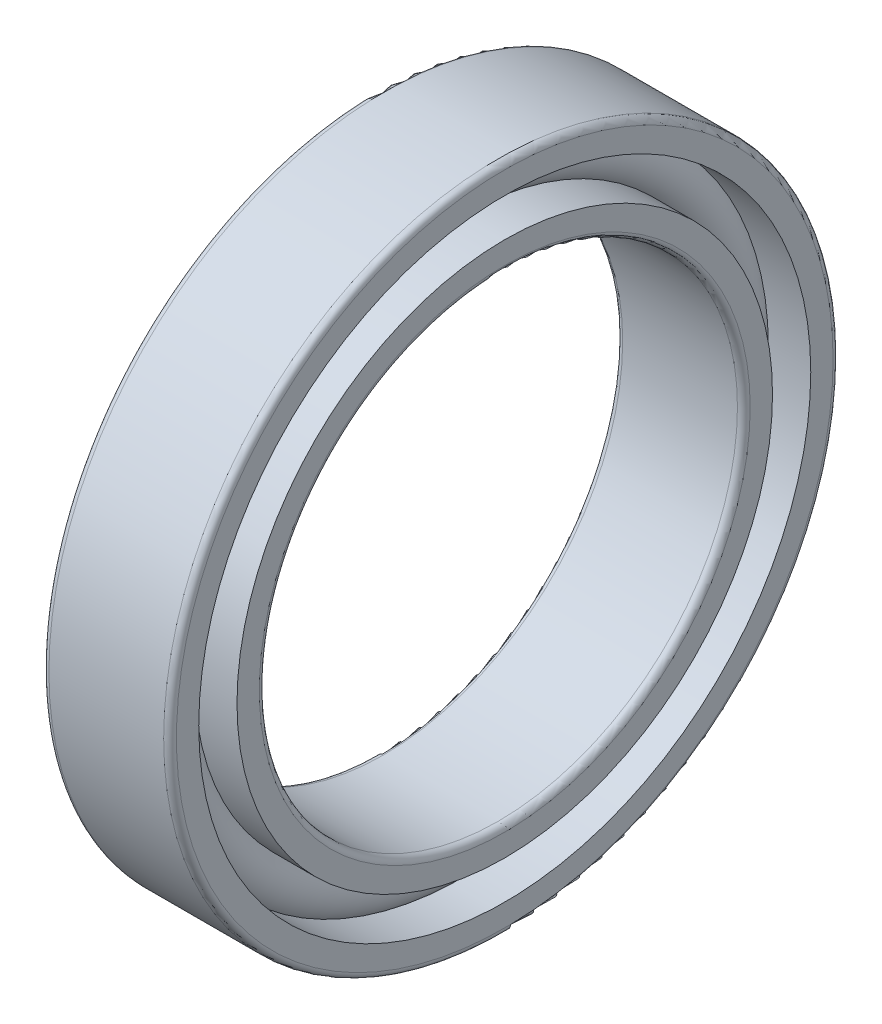
ISO-10303-21;
HEADER;
FILE_DESCRIPTION(('STEP AP214'),'2;1');
FILE_NAME('part.step','',(''),(''),'','','');
FILE_SCHEMA(('AUTOMOTIVE_DESIGN { 1 0 10303 214 1 1 1 1 }'));
ENDSEC;
DATA;
#1=APPLICATION_CONTEXT('core data for automotive mechanical design processes');
#2=APPLICATION_PROTOCOL_DEFINITION('international standard','automotive_design',2000,#1);
#3=PRODUCT_CONTEXT('',#1,'mechanical');
#4=PRODUCT('Part','Part','',(#3));
#5=PRODUCT_RELATED_PRODUCT_CATEGORY('part','',(#4));
#6=PRODUCT_DEFINITION_FORMATION('','',#4);
#7=PRODUCT_DEFINITION_CONTEXT('part definition',#1,'design');
#8=PRODUCT_DEFINITION('design','',#6,#7);
#9=PRODUCT_DEFINITION_SHAPE('','',#8);
#10=(LENGTH_UNIT() NAMED_UNIT(*) SI_UNIT(.MILLI.,.METRE.));
#11=(NAMED_UNIT(*) PLANE_ANGLE_UNIT() SI_UNIT($,.RADIAN.));
#12=(NAMED_UNIT(*) SI_UNIT($,.STERADIAN.) SOLID_ANGLE_UNIT());
#13=UNCERTAINTY_MEASURE_WITH_UNIT(LENGTH_MEASURE(1.E-05),#10,'distance_accuracy_value','');
#14=(GEOMETRIC_REPRESENTATION_CONTEXT(3) GLOBAL_UNCERTAINTY_ASSIGNED_CONTEXT((#13)) GLOBAL_UNIT_ASSIGNED_CONTEXT((#10,
#11,#12)) REPRESENTATION_CONTEXT('',''));
#15=CARTESIAN_POINT('',(0.,0.,0.));
#16=DIRECTION('',(0.,0.,1.));
#17=DIRECTION('',(1.,0.,0.));
#18=AXIS2_PLACEMENT_3D('',#15,#16,#17);
#19=CARTESIAN_POINT('',(0.,0.,0.));
#20=DIRECTION('',(-1.,0.,0.));
#21=DIRECTION('',(0.,0.,1.));
#22=AXIS2_PLACEMENT_3D('',#19,#20,#21);
#23=TOROIDAL_SURFACE('',#22,9.,0.9);
#24=CARTESIAN_POINT('',(0.670820393249932,0.,0.));
#25=DIRECTION('',(-1.,0.,0.));
#26=DIRECTION('',(0.,0.,1.));
#27=AXIS2_PLACEMENT_3D('',#24,#25,#26);
#28=CIRCLE('',#27,9.6);
#29=CARTESIAN_POINT('',(0.670820393249932,0.,9.6));
#30=VERTEX_POINT('',#29);
#31=EDGE_CURVE('E47',#30,#30,#28,.F.);
#32=ORIENTED_EDGE('',*,*,#31,.T.);
#33=EDGE_LOOP('',(#32));
#34=FACE_BOUND('',#33,.T.);
#35=CARTESIAN_POINT('',(0.670820393249938,0.,0.));
#36=DIRECTION('',(-1.,0.,0.));
#37=DIRECTION('',(0.,0.,1.));
#38=AXIS2_PLACEMENT_3D('',#35,#36,#37);
#39=CIRCLE('',#38,8.4);
#40=CARTESIAN_POINT('',(0.670820393249938,0.,8.4));
#41=VERTEX_POINT('',#40);
#42=EDGE_CURVE('E10',#41,#41,#39,.T.);
#43=ORIENTED_EDGE('',*,*,#42,.T.);
#44=EDGE_LOOP('',(#43));
#45=FACE_BOUND('',#44,.T.);
#46=ADVANCED_FACE('F43',(#34,#45),#23,.T.);
#47=CARTESIAN_POINT('',(-20.6375,0.,0.));
#48=DIRECTION('',(1.,0.,0.));
#49=DIRECTION('',(0.,0.,-1.));
#50=AXIS2_PLACEMENT_3D('',#47,#48,#49);
#51=CYLINDRICAL_SURFACE('',#50,8.4);
#52=CARTESIAN_POINT('',(2.,0.,0.));
#53=DIRECTION('',(1.,0.,0.));
#54=DIRECTION('',(0.,0.,-1.));
#55=AXIS2_PLACEMENT_3D('',#52,#53,#54);
#56=CIRCLE('',#55,8.4);
#57=CARTESIAN_POINT('',(2.,0.,-8.4));
#58=VERTEX_POINT('',#57);
#59=EDGE_CURVE('E58',#58,#58,#56,.T.);
#60=ORIENTED_EDGE('',*,*,#59,.F.);
#61=EDGE_LOOP('',(#60));
#62=FACE_BOUND('',#61,.T.);
#63=ORIENTED_EDGE('',*,*,#42,.F.);
#64=EDGE_LOOP('',(#63));
#65=FACE_BOUND('',#64,.T.);
#66=ADVANCED_FACE('F107',(#62,#65),#51,.T.);
#67=CARTESIAN_POINT('',(-20.6375,0.,0.));
#68=DIRECTION('',(1.,0.,0.));
#69=DIRECTION('',(0.,0.,-1.));
#70=AXIS2_PLACEMENT_3D('',#67,#68,#69);
#71=CYLINDRICAL_SURFACE('',#70,8.4);
#72=CARTESIAN_POINT('',(-2.,0.,0.));
#73=DIRECTION('',(1.,0.,0.));
#74=DIRECTION('',(0.,0.,-1.));
#75=AXIS2_PLACEMENT_3D('',#72,#73,#74);
#76=CIRCLE('',#75,8.4);
#77=CARTESIAN_POINT('',(-2.,0.,-8.4));
#78=VERTEX_POINT('',#77);
#79=EDGE_CURVE('E70',#78,#78,#76,.T.);
#80=ORIENTED_EDGE('',*,*,#79,.T.);
#81=EDGE_LOOP('',(#80));
#82=FACE_BOUND('',#81,.T.);
#83=CARTESIAN_POINT('',(-0.670820393249938,0.,0.));
#84=DIRECTION('',(1.,0.,0.));
#85=DIRECTION('',(0.,0.,-1.));
#86=AXIS2_PLACEMENT_3D('',#83,#84,#85);
#87=CIRCLE('',#86,8.4);
#88=CARTESIAN_POINT('',(-0.670820393249938,0.,-8.4));
#89=VERTEX_POINT('',#88);
#90=EDGE_CURVE('E52',#89,#89,#87,.T.);
#91=ORIENTED_EDGE('',*,*,#90,.F.);
#92=EDGE_LOOP('',(#91));
#93=FACE_BOUND('',#92,.T.);
#94=ADVANCED_FACE('F110',(#82,#93),#71,.T.);
#95=CARTESIAN_POINT('',(2.,7.7,0.));
#96=DIRECTION('',(1.,0.,0.));
#97=DIRECTION('',(0.,0.,-1.));
#98=AXIS2_PLACEMENT_3D('',#95,#96,#97);
#99=PLANE('',#98);
#100=ORIENTED_EDGE('',*,*,#59,.T.);
#101=EDGE_LOOP('',(#100));
#102=FACE_BOUND('',#101,.T.);
#103=CARTESIAN_POINT('',(2.,0.,0.));
#104=DIRECTION('',(1.,0.,0.));
#105=DIRECTION('',(0.,0.,-1.));
#106=AXIS2_PLACEMENT_3D('',#103,#104,#105);
#107=CIRCLE('',#106,7.7);
#108=CARTESIAN_POINT('',(2.,0.,-7.7));
#109=VERTEX_POINT('',#108);
#110=EDGE_CURVE('E97',#109,#109,#107,.T.);
#111=ORIENTED_EDGE('',*,*,#110,.F.);
#112=EDGE_LOOP('',(#111));
#113=FACE_BOUND('',#112,.T.);
#114=ADVANCED_FACE('F104',(#102,#113),#99,.T.);
#115=CARTESIAN_POINT('',(1.8,0.,0.));
#116=DIRECTION('',(1.,0.,0.));
#117=DIRECTION('',(0.,0.,-1.));
#118=AXIS2_PLACEMENT_3D('',#115,#116,#117);
#119=TOROIDAL_SURFACE('',#118,7.7,0.2);
#120=ORIENTED_EDGE('',*,*,#110,.T.);
#121=EDGE_LOOP('',(#120));
#122=FACE_BOUND('',#121,.T.);
#123=CARTESIAN_POINT('',(1.8,0.,0.));
#124=DIRECTION('',(1.,0.,0.));
#125=DIRECTION('',(0.,0.,-1.));
#126=AXIS2_PLACEMENT_3D('',#123,#124,#125);
#127=CIRCLE('',#126,7.5);
#128=CARTESIAN_POINT('',(1.8,0.,-7.5));
#129=VERTEX_POINT('',#128);
#130=EDGE_CURVE('E93',#129,#129,#127,.T.);
#131=ORIENTED_EDGE('',*,*,#130,.F.);
#132=EDGE_LOOP('',(#131));
#133=FACE_BOUND('',#132,.T.);
#134=ADVANCED_FACE('F121',(#122,#133),#119,.T.);
#135=CARTESIAN_POINT('',(-20.6375,0.,0.));
#136=DIRECTION('',(1.,0.,0.));
#137=DIRECTION('',(0.,0.,-1.));
#138=AXIS2_PLACEMENT_3D('',#135,#136,#137);
#139=CYLINDRICAL_SURFACE('',#138,7.5);
#140=ORIENTED_EDGE('',*,*,#130,.T.);
#141=EDGE_LOOP('',(#140));
#142=FACE_BOUND('',#141,.T.);
#143=CARTESIAN_POINT('',(-1.8,0.,0.));
#144=DIRECTION('',(1.,0.,0.));
#145=DIRECTION('',(0.,0.,-1.));
#146=AXIS2_PLACEMENT_3D('',#143,#144,#145);
#147=CIRCLE('',#146,7.5);
#148=CARTESIAN_POINT('',(-1.8,0.,-7.5));
#149=VERTEX_POINT('',#148);
#150=EDGE_CURVE('E89',#149,#149,#147,.T.);
#151=ORIENTED_EDGE('',*,*,#150,.F.);
#152=EDGE_LOOP('',(#151));
#153=FACE_BOUND('',#152,.T.);
#154=ADVANCED_FACE('F124',(#142,#153),#139,.F.);
#155=CARTESIAN_POINT('',(-1.8,0.,0.));
#156=DIRECTION('',(1.,0.,0.));
#157=DIRECTION('',(0.,0.,-1.));
#158=AXIS2_PLACEMENT_3D('',#155,#156,#157);
#159=TOROIDAL_SURFACE('',#158,7.7,0.2);
#160=ORIENTED_EDGE('',*,*,#150,.T.);
#161=EDGE_LOOP('',(#160));
#162=FACE_BOUND('',#161,.T.);
#163=CARTESIAN_POINT('',(-2.,0.,0.));
#164=DIRECTION('',(1.,0.,0.));
#165=DIRECTION('',(0.,0.,-1.));
#166=AXIS2_PLACEMENT_3D('',#163,#164,#165);
#167=CIRCLE('',#166,7.7);
#168=CARTESIAN_POINT('',(-2.,0.,-7.7));
#169=VERTEX_POINT('',#168);
#170=EDGE_CURVE('E85',#169,#169,#167,.T.);
#171=ORIENTED_EDGE('',*,*,#170,.F.);
#172=EDGE_LOOP('',(#171));
#173=FACE_BOUND('',#172,.T.);
#174=ADVANCED_FACE('F128',(#162,#173),#159,.T.);
#175=CARTESIAN_POINT('',(-2.,8.4,0.));
#176=DIRECTION('',(-1.,0.,0.));
#177=DIRECTION('',(0.,0.,1.));
#178=AXIS2_PLACEMENT_3D('',#175,#176,#177);
#179=PLANE('',#178);
#180=ORIENTED_EDGE('',*,*,#170,.T.);
#181=EDGE_LOOP('',(#180));
#182=FACE_BOUND('',#181,.T.);
#183=ORIENTED_EDGE('',*,*,#79,.F.);
#184=EDGE_LOOP('',(#183));
#185=FACE_BOUND('',#184,.T.);
#186=ADVANCED_FACE('F132',(#182,#185),#179,.T.);
#187=CARTESIAN_POINT('',(-0.670820393249932,0.,0.));
#188=DIRECTION('',(1.,0.,0.));
#189=DIRECTION('',(0.,0.,-1.));
#190=AXIS2_PLACEMENT_3D('',#187,#188,#189);
#191=CIRCLE('',#190,9.6);
#192=CARTESIAN_POINT('',(-0.670820393249932,0.,-9.6));
#193=VERTEX_POINT('',#192);
#194=EDGE_CURVE('E61',#193,#193,#191,.F.);
#195=ORIENTED_EDGE('',*,*,#194,.T.);
#196=EDGE_LOOP('',(#195));
#197=FACE_BOUND('',#196,.T.);
#198=ORIENTED_EDGE('',*,*,#90,.T.);
#199=EDGE_LOOP('',(#198));
#200=FACE_BOUND('',#199,.T.);
#201=ADVANCED_FACE('F45',(#197,#200),#23,.T.);
#202=CARTESIAN_POINT('',(-20.6375,0.,0.));
#203=DIRECTION('',(1.,0.,0.));
#204=DIRECTION('',(0.,0.,-1.));
#205=AXIS2_PLACEMENT_3D('',#202,#203,#204);
#206=CYLINDRICAL_SURFACE('',#205,9.6);
#207=CARTESIAN_POINT('',(2.,0.,0.));
#208=DIRECTION('',(1.,0.,0.));
#209=DIRECTION('',(0.,0.,-1.));
#210=AXIS2_PLACEMENT_3D('',#207,#208,#209);
#211=CIRCLE('',#210,9.6);
#212=CARTESIAN_POINT('',(2.,0.,-9.6));
#213=VERTEX_POINT('',#212);
#214=EDGE_CURVE('E64',#213,#213,#211,.T.);
#215=ORIENTED_EDGE('',*,*,#214,.T.);
#216=EDGE_LOOP('',(#215));
#217=FACE_BOUND('',#216,.T.);
#218=ORIENTED_EDGE('',*,*,#31,.F.);
#219=EDGE_LOOP('',(#218));
#220=FACE_BOUND('',#219,.T.);
#221=ADVANCED_FACE('F137',(#217,#220),#206,.F.);
#222=CARTESIAN_POINT('',(-20.6375,0.,0.));
#223=DIRECTION('',(1.,0.,0.));
#224=DIRECTION('',(0.,0.,-1.));
#225=AXIS2_PLACEMENT_3D('',#222,#223,#224);
#226=CYLINDRICAL_SURFACE('',#225,9.6);
#227=CARTESIAN_POINT('',(-2.,0.,0.));
#228=DIRECTION('',(1.,0.,0.));
#229=DIRECTION('',(0.,0.,-1.));
#230=AXIS2_PLACEMENT_3D('',#227,#228,#229);
#231=CIRCLE('',#230,9.6);
#232=CARTESIAN_POINT('',(-2.,0.,-9.6));
#233=VERTEX_POINT('',#232);
#234=EDGE_CURVE('E168',#233,#233,#231,.T.);
#235=ORIENTED_EDGE('',*,*,#234,.F.);
#236=EDGE_LOOP('',(#235));
#237=FACE_BOUND('',#236,.T.);
#238=ORIENTED_EDGE('',*,*,#194,.F.);
#239=EDGE_LOOP('',(#238));
#240=FACE_BOUND('',#239,.T.);
#241=ADVANCED_FACE('F140',(#237,#240),#226,.F.);
#242=CARTESIAN_POINT('',(2.,10.3,0.));
#243=DIRECTION('',(1.,0.,0.));
#244=DIRECTION('',(0.,0.,-1.));
#245=AXIS2_PLACEMENT_3D('',#242,#243,#244);
#246=PLANE('',#245);
#247=CARTESIAN_POINT('',(2.,0.,0.));
#248=DIRECTION('',(1.,0.,0.));
#249=DIRECTION('',(0.,0.,-1.));
#250=AXIS2_PLACEMENT_3D('',#247,#248,#249);
#251=CIRCLE('',#250,10.3);
#252=CARTESIAN_POINT('',(2.,0.,-10.3));
#253=VERTEX_POINT('',#252);
#254=EDGE_CURVE('E72',#253,#253,#251,.T.);
#255=ORIENTED_EDGE('',*,*,#254,.T.);
#256=EDGE_LOOP('',(#255));
#257=FACE_BOUND('',#256,.T.);
#258=ORIENTED_EDGE('',*,*,#214,.F.);
#259=EDGE_LOOP('',(#258));
#260=FACE_BOUND('',#259,.T.);
#261=ADVANCED_FACE('F141',(#257,#260),#246,.T.);
#262=CARTESIAN_POINT('',(1.8,0.,0.));
#263=DIRECTION('',(1.,0.,0.));
#264=DIRECTION('',(0.,0.,-1.));
#265=AXIS2_PLACEMENT_3D('',#262,#263,#264);
#266=TOROIDAL_SURFACE('',#265,10.3,0.199999999999999);
#267=CARTESIAN_POINT('',(1.8,0.,0.));
#268=DIRECTION('',(1.,0.,0.));
#269=DIRECTION('',(0.,0.,-1.));
#270=AXIS2_PLACEMENT_3D('',#267,#268,#269);
#271=CIRCLE('',#270,10.5);
#272=CARTESIAN_POINT('',(1.8,0.,-10.5));
#273=VERTEX_POINT('',#272);
#274=EDGE_CURVE('E78',#273,#273,#271,.T.);
#275=ORIENTED_EDGE('',*,*,#274,.T.);
#276=EDGE_LOOP('',(#275));
#277=FACE_BOUND('',#276,.T.);
#278=ORIENTED_EDGE('',*,*,#254,.F.);
#279=EDGE_LOOP('',(#278));
#280=FACE_BOUND('',#279,.T.);
#281=ADVANCED_FACE('F144',(#277,#280),#266,.T.);
#282=CARTESIAN_POINT('',(-20.6375,0.,0.));
#283=DIRECTION('',(1.,0.,0.));
#284=DIRECTION('',(0.,0.,-1.));
#285=AXIS2_PLACEMENT_3D('',#282,#283,#284);
#286=CYLINDRICAL_SURFACE('',#285,10.5);
#287=CARTESIAN_POINT('',(-1.8,0.,0.));
#288=DIRECTION('',(1.,0.,0.));
#289=DIRECTION('',(0.,0.,-1.));
#290=AXIS2_PLACEMENT_3D('',#287,#288,#289);
#291=CIRCLE('',#290,10.5);
#292=CARTESIAN_POINT('',(-1.8,0.,-10.5));
#293=VERTEX_POINT('',#292);
#294=EDGE_CURVE('E174',#293,#293,#291,.T.);
#295=ORIENTED_EDGE('',*,*,#294,.T.);
#296=EDGE_LOOP('',(#295));
#297=FACE_BOUND('',#296,.T.);
#298=ORIENTED_EDGE('',*,*,#274,.F.);
#299=EDGE_LOOP('',(#298));
#300=FACE_BOUND('',#299,.T.);
#301=ADVANCED_FACE('F148',(#297,#300),#286,.T.);
#302=CARTESIAN_POINT('',(-1.8,0.,0.));
#303=DIRECTION('',(1.,0.,0.));
#304=DIRECTION('',(0.,0.,-1.));
#305=AXIS2_PLACEMENT_3D('',#302,#303,#304);
#306=TOROIDAL_SURFACE('',#305,10.3,0.199999999999999);
#307=CARTESIAN_POINT('',(-2.,0.,0.));
#308=DIRECTION('',(1.,0.,0.));
#309=DIRECTION('',(0.,0.,-1.));
#310=AXIS2_PLACEMENT_3D('',#307,#308,#309);
#311=CIRCLE('',#310,10.3);
#312=CARTESIAN_POINT('',(-2.,0.,-10.3));
#313=VERTEX_POINT('',#312);
#314=EDGE_CURVE('E170',#313,#313,#311,.T.);
#315=ORIENTED_EDGE('',*,*,#314,.T.);
#316=EDGE_LOOP('',(#315));
#317=FACE_BOUND('',#316,.T.);
#318=ORIENTED_EDGE('',*,*,#294,.F.);
#319=EDGE_LOOP('',(#318));
#320=FACE_BOUND('',#319,.T.);
#321=ADVANCED_FACE('F152',(#317,#320),#306,.T.);
#322=CARTESIAN_POINT('',(-2.,9.6,0.));
#323=DIRECTION('',(-1.,0.,0.));
#324=DIRECTION('',(0.,0.,1.));
#325=AXIS2_PLACEMENT_3D('',#322,#323,#324);
#326=PLANE('',#325);
#327=ORIENTED_EDGE('',*,*,#234,.T.);
#328=EDGE_LOOP('',(#327));
#329=FACE_BOUND('',#328,.T.);
#330=ORIENTED_EDGE('',*,*,#314,.F.);
#331=EDGE_LOOP('',(#330));
#332=FACE_BOUND('',#331,.T.);
#333=ADVANCED_FACE('F156',(#329,#332),#326,.T.);
#334=CLOSED_SHELL('',(#46,#66,#94,#114,#134,#154,#174,#186,#201,#221,#241,#261,#281,#301,#321,#333));
#335=MANIFOLD_SOLID_BREP('B2',#334);
#336=ADVANCED_BREP_SHAPE_REPRESENTATION('',(#18,#335),#14);
#337=SHAPE_DEFINITION_REPRESENTATION(#9,#336);
ENDSEC;
END-ISO-10303-21;
